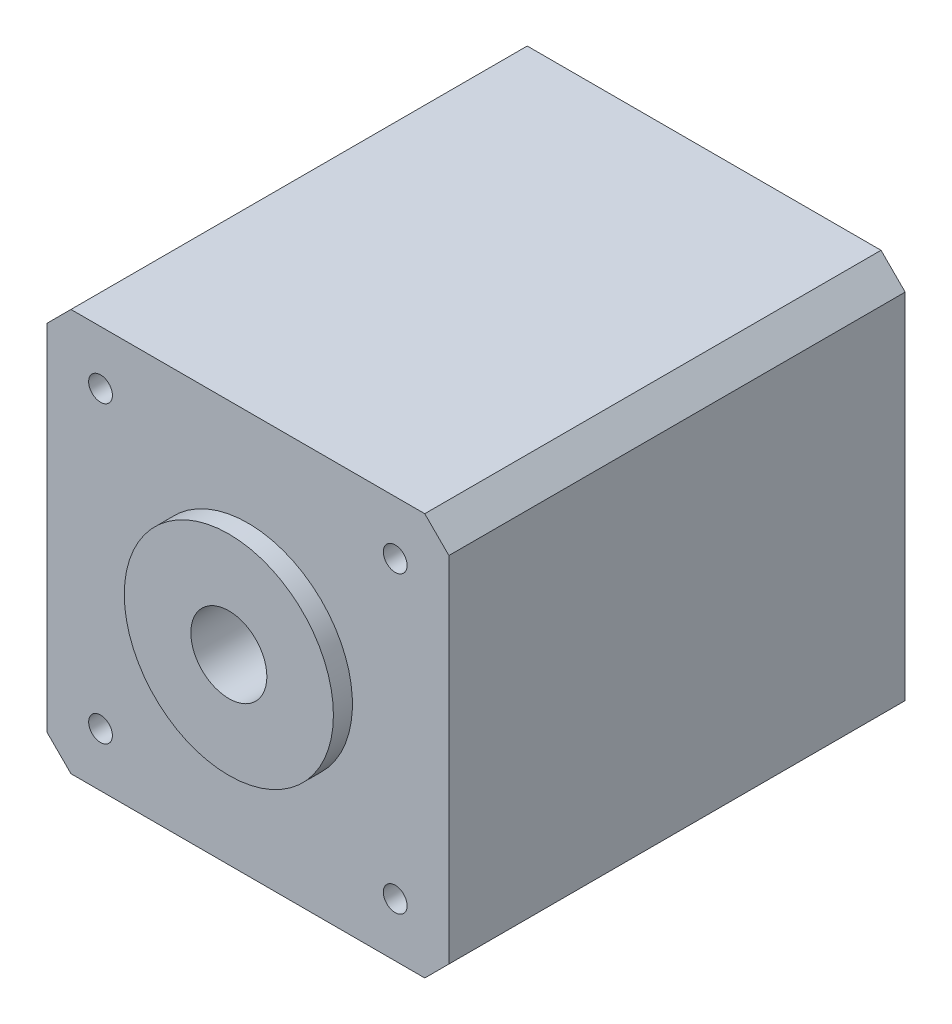
ISO-10303-21;
HEADER;
FILE_DESCRIPTION(('STEP AP214'),'2;1');
FILE_NAME('part.step','',(''),(''),'','','');
FILE_SCHEMA(('AUTOMOTIVE_DESIGN { 1 0 10303 214 1 1 1 1 }'));
ENDSEC;
DATA;
#1=APPLICATION_CONTEXT('core data for automotive mechanical design processes');
#2=APPLICATION_PROTOCOL_DEFINITION('international standard','automotive_design',2000,#1);
#3=PRODUCT_CONTEXT('',#1,'mechanical');
#4=PRODUCT('Part','Part','',(#3));
#5=PRODUCT_RELATED_PRODUCT_CATEGORY('part','',(#4));
#6=PRODUCT_DEFINITION_FORMATION('','',#4);
#7=PRODUCT_DEFINITION_CONTEXT('part definition',#1,'design');
#8=PRODUCT_DEFINITION('design','',#6,#7);
#9=PRODUCT_DEFINITION_SHAPE('','',#8);
#10=(LENGTH_UNIT() NAMED_UNIT(*) SI_UNIT(.MILLI.,.METRE.));
#11=(NAMED_UNIT(*) PLANE_ANGLE_UNIT() SI_UNIT($,.RADIAN.));
#12=(NAMED_UNIT(*) SI_UNIT($,.STERADIAN.) SOLID_ANGLE_UNIT());
#13=UNCERTAINTY_MEASURE_WITH_UNIT(LENGTH_MEASURE(1.E-05),#10,'distance_accuracy_value','');
#14=(GEOMETRIC_REPRESENTATION_CONTEXT(3) GLOBAL_UNCERTAINTY_ASSIGNED_CONTEXT((#13)) GLOBAL_UNIT_ASSIGNED_CONTEXT((#10,
#11,#12)) REPRESENTATION_CONTEXT('',''));
#15=CARTESIAN_POINT('',(0.,0.,0.));
#16=DIRECTION('',(0.,0.,1.));
#17=DIRECTION('',(1.,0.,0.));
#18=AXIS2_PLACEMENT_3D('',#15,#16,#17);
#19=CARTESIAN_POINT('',(0.,0.,48.));
#20=DIRECTION('',(1.,0.,0.));
#21=DIRECTION('',(0.,0.,-1.));
#22=AXIS2_PLACEMENT_3D('',#19,#20,#21);
#23=PLANE('',#22);
#24=DIRECTION('',(0.,-1.,0.));
#25=VECTOR('',#24,1.);
#26=CARTESIAN_POINT('',(0.,0.,0.));
#27=LINE('',#26,#25);
#28=CARTESIAN_POINT('',(0.,39.76,0.));
#29=VERTEX_POINT('',#28);
#30=CARTESIAN_POINT('',(0.,2.54,0.));
#31=VERTEX_POINT('',#30);
#32=EDGE_CURVE('E145',#29,#31,#27,.T.);
#33=ORIENTED_EDGE('',*,*,#32,.T.);
#34=DIRECTION('',(0.,0.,1.));
#35=VECTOR('',#34,1.);
#36=CARTESIAN_POINT('',(0.,2.54,48.));
#37=LINE('',#36,#35);
#38=CARTESIAN_POINT('',(0.,2.54,48.));
#39=VERTEX_POINT('',#38);
#40=EDGE_CURVE('E197',#31,#39,#37,.T.);
#41=ORIENTED_EDGE('',*,*,#40,.T.);
#42=DIRECTION('',(0.,-1.,0.));
#43=VECTOR('',#42,1.);
#44=CARTESIAN_POINT('',(0.,0.,48.));
#45=LINE('',#44,#43);
#46=CARTESIAN_POINT('',(0.,39.76,48.));
#47=VERTEX_POINT('',#46);
#48=EDGE_CURVE('E146',#47,#39,#45,.T.);
#49=ORIENTED_EDGE('',*,*,#48,.F.);
#50=DIRECTION('',(0.,0.,-1.));
#51=VECTOR('',#50,1.);
#52=CARTESIAN_POINT('',(0.,39.76,48.));
#53=LINE('',#52,#51);
#54=EDGE_CURVE('E194',#47,#29,#53,.T.);
#55=ORIENTED_EDGE('',*,*,#54,.T.);
#56=EDGE_LOOP('',(#33,#41,#49,#55));
#57=FACE_BOUND('',#56,.T.);
#58=ADVANCED_FACE('F35',(#57),#23,.F.);
#59=CARTESIAN_POINT('',(0.,0.,48.));
#60=DIRECTION('',(0.,1.,0.));
#61=DIRECTION('',(0.,0.,1.));
#62=AXIS2_PLACEMENT_3D('',#59,#60,#61);
#63=PLANE('',#62);
#64=DIRECTION('',(1.,0.,0.));
#65=VECTOR('',#64,1.);
#66=CARTESIAN_POINT('',(0.,0.,0.));
#67=LINE('',#66,#65);
#68=CARTESIAN_POINT('',(2.53999999999999,0.,0.));
#69=VERTEX_POINT('',#68);
#70=CARTESIAN_POINT('',(39.76,0.,0.));
#71=VERTEX_POINT('',#70);
#72=EDGE_CURVE('E160',#69,#71,#67,.T.);
#73=ORIENTED_EDGE('',*,*,#72,.T.);
#74=DIRECTION('',(0.,0.,1.));
#75=VECTOR('',#74,1.);
#76=CARTESIAN_POINT('',(39.76,0.,48.));
#77=LINE('',#76,#75);
#78=CARTESIAN_POINT('',(39.76,0.,48.));
#79=VERTEX_POINT('',#78);
#80=EDGE_CURVE('E185',#71,#79,#77,.T.);
#81=ORIENTED_EDGE('',*,*,#80,.T.);
#82=DIRECTION('',(1.,0.,0.));
#83=VECTOR('',#82,1.);
#84=CARTESIAN_POINT('',(0.,0.,48.));
#85=LINE('',#84,#83);
#86=CARTESIAN_POINT('',(2.53999999999999,0.,48.));
#87=VERTEX_POINT('',#86);
#88=EDGE_CURVE('E149',#87,#79,#85,.T.);
#89=ORIENTED_EDGE('',*,*,#88,.F.);
#90=DIRECTION('',(0.,0.,-1.));
#91=VECTOR('',#90,1.);
#92=CARTESIAN_POINT('',(2.53999999999999,0.,48.));
#93=LINE('',#92,#91);
#94=EDGE_CURVE('E182',#87,#69,#93,.T.);
#95=ORIENTED_EDGE('',*,*,#94,.T.);
#96=EDGE_LOOP('',(#73,#81,#89,#95));
#97=FACE_BOUND('',#96,.T.);
#98=ADVANCED_FACE('F222',(#97),#63,.F.);
#99=CARTESIAN_POINT('',(42.3,0.,48.));
#100=DIRECTION('',(-1.,0.,0.));
#101=DIRECTION('',(0.,0.,1.));
#102=AXIS2_PLACEMENT_3D('',#99,#100,#101);
#103=PLANE('',#102);
#104=DIRECTION('',(0.,1.,0.));
#105=VECTOR('',#104,1.);
#106=CARTESIAN_POINT('',(42.3,0.,48.));
#107=LINE('',#106,#105);
#108=CARTESIAN_POINT('',(42.3,2.53999999999999,48.));
#109=VERTEX_POINT('',#108);
#110=CARTESIAN_POINT('',(42.3,39.76,48.));
#111=VERTEX_POINT('',#110);
#112=EDGE_CURVE('E153',#109,#111,#107,.T.);
#113=ORIENTED_EDGE('',*,*,#112,.F.);
#114=DIRECTION('',(0.,0.,-1.));
#115=VECTOR('',#114,1.);
#116=CARTESIAN_POINT('',(42.3,2.53999999999999,48.));
#117=LINE('',#116,#115);
#118=CARTESIAN_POINT('',(42.3,2.53999999999999,0.));
#119=VERTEX_POINT('',#118);
#120=EDGE_CURVE('E171',#109,#119,#117,.T.);
#121=ORIENTED_EDGE('',*,*,#120,.T.);
#122=DIRECTION('',(0.,1.,0.));
#123=VECTOR('',#122,1.);
#124=CARTESIAN_POINT('',(42.3,0.,0.));
#125=LINE('',#124,#123);
#126=CARTESIAN_POINT('',(42.3,39.76,0.));
#127=VERTEX_POINT('',#126);
#128=EDGE_CURVE('E163',#119,#127,#125,.T.);
#129=ORIENTED_EDGE('',*,*,#128,.T.);
#130=DIRECTION('',(0.,0.,1.));
#131=VECTOR('',#130,1.);
#132=CARTESIAN_POINT('',(42.3,39.76,48.));
#133=LINE('',#132,#131);
#134=EDGE_CURVE('E169',#127,#111,#133,.T.);
#135=ORIENTED_EDGE('',*,*,#134,.T.);
#136=EDGE_LOOP('',(#113,#121,#129,#135));
#137=FACE_BOUND('',#136,.T.);
#138=ADVANCED_FACE('F230',(#137),#103,.F.);
#139=CARTESIAN_POINT('',(0.,42.3,48.));
#140=DIRECTION('',(0.,-1.,0.));
#141=DIRECTION('',(0.,0.,-1.));
#142=AXIS2_PLACEMENT_3D('',#139,#140,#141);
#143=PLANE('',#142);
#144=DIRECTION('',(-1.,0.,0.));
#145=VECTOR('',#144,1.);
#146=CARTESIAN_POINT('',(0.,42.3,0.));
#147=LINE('',#146,#145);
#148=CARTESIAN_POINT('',(39.76,42.3,0.));
#149=VERTEX_POINT('',#148);
#150=CARTESIAN_POINT('',(2.54000000000001,42.3,0.));
#151=VERTEX_POINT('',#150);
#152=EDGE_CURVE('E150',#149,#151,#147,.T.);
#153=ORIENTED_EDGE('',*,*,#152,.T.);
#154=DIRECTION('',(0.,0.,1.));
#155=VECTOR('',#154,1.);
#156=CARTESIAN_POINT('',(2.54000000000001,42.3,48.));
#157=LINE('',#156,#155);
#158=CARTESIAN_POINT('',(2.54000000000001,42.3,48.));
#159=VERTEX_POINT('',#158);
#160=EDGE_CURVE('E11',#151,#159,#157,.T.);
#161=ORIENTED_EDGE('',*,*,#160,.T.);
#162=DIRECTION('',(-1.,0.,0.));
#163=VECTOR('',#162,1.);
#164=CARTESIAN_POINT('',(0.,42.3,48.));
#165=LINE('',#164,#163);
#166=CARTESIAN_POINT('',(39.76,42.3,48.));
#167=VERTEX_POINT('',#166);
#168=EDGE_CURVE('E155',#167,#159,#165,.T.);
#169=ORIENTED_EDGE('',*,*,#168,.F.);
#170=DIRECTION('',(0.,0.,-1.));
#171=VECTOR('',#170,1.);
#172=CARTESIAN_POINT('',(39.76,42.3,48.));
#173=LINE('',#172,#171);
#174=EDGE_CURVE('E43',#167,#149,#173,.T.);
#175=ORIENTED_EDGE('',*,*,#174,.T.);
#176=EDGE_LOOP('',(#153,#161,#169,#175));
#177=FACE_BOUND('',#176,.T.);
#178=ADVANCED_FACE('F201',(#177),#143,.F.);
#179=CARTESIAN_POINT('',(0.,0.,48.));
#180=DIRECTION('',(0.,0.,-1.));
#181=DIRECTION('',(-1.,0.,0.));
#182=AXIS2_PLACEMENT_3D('',#179,#180,#181);
#183=PLANE('',#182);
#184=CARTESIAN_POINT('',(21.15,21.15,48.));
#185=DIRECTION('',(0.,0.,-1.));
#186=DIRECTION('',(-1.,0.,0.));
#187=AXIS2_PLACEMENT_3D('',#184,#185,#186);
#188=CIRCLE('',#187,11.);
#189=CARTESIAN_POINT('',(10.15,21.15,48.));
#190=VERTEX_POINT('',#189);
#191=EDGE_CURVE('E157',#190,#190,#188,.F.);
#192=ORIENTED_EDGE('',*,*,#191,.F.);
#193=EDGE_LOOP('',(#192));
#194=FACE_BOUND('',#193,.T.);
#195=CARTESIAN_POINT('',(36.65,36.65,48.));
#196=DIRECTION('',(0.,0.,1.));
#197=DIRECTION('',(1.,0.,0.));
#198=AXIS2_PLACEMENT_3D('',#195,#196,#197);
#199=CIRCLE('',#198,1.24999999999999);
#200=CARTESIAN_POINT('',(37.9,36.65,48.));
#201=VERTEX_POINT('',#200);
#202=EDGE_CURVE('E121',#201,#201,#199,.T.);
#203=ORIENTED_EDGE('',*,*,#202,.F.);
#204=EDGE_LOOP('',(#203));
#205=FACE_BOUND('',#204,.T.);
#206=CARTESIAN_POINT('',(5.64999999999999,5.65,48.));
#207=DIRECTION('',(0.,0.,1.));
#208=DIRECTION('',(1.,0.,0.));
#209=AXIS2_PLACEMENT_3D('',#206,#207,#208);
#210=CIRCLE('',#209,1.24999999999999);
#211=CARTESIAN_POINT('',(6.89999999999998,5.65,48.));
#212=VERTEX_POINT('',#211);
#213=EDGE_CURVE('E120',#212,#212,#210,.T.);
#214=ORIENTED_EDGE('',*,*,#213,.F.);
#215=EDGE_LOOP('',(#214));
#216=FACE_BOUND('',#215,.T.);
#217=CARTESIAN_POINT('',(5.64999999999999,36.65,48.));
#218=DIRECTION('',(0.,0.,1.));
#219=DIRECTION('',(1.,0.,0.));
#220=AXIS2_PLACEMENT_3D('',#217,#218,#219);
#221=CIRCLE('',#220,1.24999999999999);
#222=CARTESIAN_POINT('',(6.89999999999998,36.65,48.));
#223=VERTEX_POINT('',#222);
#224=EDGE_CURVE('E133',#223,#223,#221,.T.);
#225=ORIENTED_EDGE('',*,*,#224,.F.);
#226=EDGE_LOOP('',(#225));
#227=FACE_BOUND('',#226,.T.);
#228=CARTESIAN_POINT('',(36.65,5.65,48.));
#229=DIRECTION('',(0.,0.,1.));
#230=DIRECTION('',(1.,0.,0.));
#231=AXIS2_PLACEMENT_3D('',#228,#229,#230);
#232=CIRCLE('',#231,1.24999999999999);
#233=CARTESIAN_POINT('',(37.9,5.65,48.));
#234=VERTEX_POINT('',#233);
#235=EDGE_CURVE('E139',#234,#234,#232,.T.);
#236=ORIENTED_EDGE('',*,*,#235,.F.);
#237=EDGE_LOOP('',(#236));
#238=FACE_BOUND('',#237,.T.);
#239=ORIENTED_EDGE('',*,*,#88,.T.);
#240=DIRECTION('',(-0.707106781186549,-0.707106781186546,0.));
#241=VECTOR('',#240,1.);
#242=CARTESIAN_POINT('',(42.3,2.53999999999999,48.));
#243=LINE('',#242,#241);
#244=EDGE_CURVE('E192',#79,#109,#243,.F.);
#245=ORIENTED_EDGE('',*,*,#244,.T.);
#246=ORIENTED_EDGE('',*,*,#112,.T.);
#247=DIRECTION('',(0.707106781186546,-0.70710678118655,0.));
#248=VECTOR('',#247,1.);
#249=CARTESIAN_POINT('',(39.76,42.3,48.));
#250=LINE('',#249,#248);
#251=EDGE_CURVE('E55',#111,#167,#250,.F.);
#252=ORIENTED_EDGE('',*,*,#251,.T.);
#253=ORIENTED_EDGE('',*,*,#168,.T.);
#254=DIRECTION('',(0.70710678118655,0.707106781186546,0.));
#255=VECTOR('',#254,1.);
#256=CARTESIAN_POINT('',(0.,39.76,48.));
#257=LINE('',#256,#255);
#258=EDGE_CURVE('E188',#159,#47,#257,.F.);
#259=ORIENTED_EDGE('',*,*,#258,.T.);
#260=ORIENTED_EDGE('',*,*,#48,.T.);
#261=DIRECTION('',(-0.707106781186546,0.707106781186549,0.));
#262=VECTOR('',#261,1.);
#263=CARTESIAN_POINT('',(2.53999999999999,0.,48.));
#264=LINE('',#263,#262);
#265=EDGE_CURVE('E190',#39,#87,#264,.F.);
#266=ORIENTED_EDGE('',*,*,#265,.T.);
#267=EDGE_LOOP('',(#239,#245,#246,#252,#253,#259,#260,#266));
#268=FACE_BOUND('',#267,.T.);
#269=ADVANCED_FACE('F215',(#194,#205,#216,#227,#238,#268),#183,.F.);
#270=CARTESIAN_POINT('',(0.,0.,0.));
#271=DIRECTION('',(0.,0.,-1.));
#272=DIRECTION('',(-1.,0.,0.));
#273=AXIS2_PLACEMENT_3D('',#270,#271,#272);
#274=PLANE('',#273);
#275=CARTESIAN_POINT('',(21.15,21.15,0.));
#276=DIRECTION('',(0.,0.,1.));
#277=DIRECTION('',(1.,0.,0.));
#278=AXIS2_PLACEMENT_3D('',#275,#276,#277);
#279=CIRCLE('',#278,4.);
#280=CARTESIAN_POINT('',(25.15,21.15,0.));
#281=VERTEX_POINT('',#280);
#282=EDGE_CURVE('E473',#281,#281,#279,.T.);
#283=ORIENTED_EDGE('',*,*,#282,.T.);
#284=EDGE_LOOP('',(#283));
#285=FACE_BOUND('',#284,.T.);
#286=ORIENTED_EDGE('',*,*,#128,.F.);
#287=DIRECTION('',(0.707106781186549,0.707106781186546,0.));
#288=VECTOR('',#287,1.);
#289=CARTESIAN_POINT('',(19.8799999999999,-19.88,0.));
#290=LINE('',#289,#288);
#291=EDGE_CURVE('E180',#119,#71,#290,.F.);
#292=ORIENTED_EDGE('',*,*,#291,.T.);
#293=ORIENTED_EDGE('',*,*,#72,.F.);
#294=DIRECTION('',(0.707106781186546,-0.707106781186549,0.));
#295=VECTOR('',#294,1.);
#296=CARTESIAN_POINT('',(1.27,1.26999999999999,0.));
#297=LINE('',#296,#295);
#298=EDGE_CURVE('E178',#69,#31,#297,.F.);
#299=ORIENTED_EDGE('',*,*,#298,.T.);
#300=ORIENTED_EDGE('',*,*,#32,.F.);
#301=DIRECTION('',(-0.70710678118655,-0.707106781186546,0.));
#302=VECTOR('',#301,1.);
#303=CARTESIAN_POINT('',(-19.88,19.8800000000001,0.));
#304=LINE('',#303,#302);
#305=EDGE_CURVE('E176',#29,#151,#304,.F.);
#306=ORIENTED_EDGE('',*,*,#305,.T.);
#307=ORIENTED_EDGE('',*,*,#152,.F.);
#308=DIRECTION('',(-0.707106781186546,0.70710678118655,0.));
#309=VECTOR('',#308,1.);
#310=CARTESIAN_POINT('',(41.0300000000001,41.0299999999999,0.));
#311=LINE('',#310,#309);
#312=EDGE_CURVE('E174',#149,#127,#311,.F.);
#313=ORIENTED_EDGE('',*,*,#312,.T.);
#314=EDGE_LOOP('',(#286,#292,#293,#299,#300,#306,#307,#313));
#315=FACE_BOUND('',#314,.T.);
#316=ADVANCED_FACE('F205',(#285,#315),#274,.T.);
#317=CARTESIAN_POINT('',(36.65,5.65,40.132));
#318=DIRECTION('',(0.,0.,1.));
#319=DIRECTION('',(1.,0.,0.));
#320=AXIS2_PLACEMENT_3D('',#317,#318,#319);
#321=CONICAL_SURFACE('',#320,1.25,1.02974425867666);
#322=CARTESIAN_POINT('',(36.65,5.65,39.3809242262155));
#323=VERTEX_POINT('',#322);
#324=VERTEX_LOOP('',#323);
#325=FACE_BOUND('',#324,.T.);
#326=CARTESIAN_POINT('',(36.65,5.65,40.132));
#327=DIRECTION('',(0.,0.,1.));
#328=DIRECTION('',(1.,0.,0.));
#329=AXIS2_PLACEMENT_3D('',#326,#327,#328);
#330=CIRCLE('',#329,1.25);
#331=CARTESIAN_POINT('',(37.9,5.65,40.132));
#332=VERTEX_POINT('',#331);
#333=EDGE_CURVE('E142',#332,#332,#330,.T.);
#334=ORIENTED_EDGE('',*,*,#333,.T.);
#335=EDGE_LOOP('',(#334));
#336=FACE_BOUND('',#335,.T.);
#337=ADVANCED_FACE('F368',(#325,#336),#321,.F.);
#338=CARTESIAN_POINT('',(36.65,5.65,48.));
#339=DIRECTION('',(0.,0.,1.));
#340=DIRECTION('',(1.,0.,0.));
#341=AXIS2_PLACEMENT_3D('',#338,#339,#340);
#342=CYLINDRICAL_SURFACE('',#341,1.24999999999999);
#343=ORIENTED_EDGE('',*,*,#333,.F.);
#344=EDGE_LOOP('',(#343));
#345=FACE_BOUND('',#344,.T.);
#346=ORIENTED_EDGE('',*,*,#235,.T.);
#347=EDGE_LOOP('',(#346));
#348=FACE_BOUND('',#347,.T.);
#349=ADVANCED_FACE('F358',(#345,#348),#342,.F.);
#350=CARTESIAN_POINT('',(5.64999999999999,36.65,40.132));
#351=DIRECTION('',(0.,0.,1.));
#352=DIRECTION('',(1.,0.,0.));
#353=AXIS2_PLACEMENT_3D('',#350,#351,#352);
#354=CONICAL_SURFACE('',#353,1.25,1.02974425867665);
#355=CARTESIAN_POINT('',(5.64999999999999,36.65,39.3809242262155));
#356=VERTEX_POINT('',#355);
#357=VERTEX_LOOP('',#356);
#358=FACE_BOUND('',#357,.T.);
#359=CARTESIAN_POINT('',(5.64999999999999,36.65,40.132));
#360=DIRECTION('',(0.,0.,1.));
#361=DIRECTION('',(1.,0.,0.));
#362=AXIS2_PLACEMENT_3D('',#359,#360,#361);
#363=CIRCLE('',#362,1.25);
#364=CARTESIAN_POINT('',(6.89999999999999,36.65,40.132));
#365=VERTEX_POINT('',#364);
#366=EDGE_CURVE('E136',#365,#365,#363,.T.);
#367=ORIENTED_EDGE('',*,*,#366,.T.);
#368=EDGE_LOOP('',(#367));
#369=FACE_BOUND('',#368,.T.);
#370=ADVANCED_FACE('F348',(#358,#369),#354,.F.);
#371=CARTESIAN_POINT('',(5.64999999999999,36.65,48.));
#372=DIRECTION('',(0.,0.,1.));
#373=DIRECTION('',(1.,0.,0.));
#374=AXIS2_PLACEMENT_3D('',#371,#372,#373);
#375=CYLINDRICAL_SURFACE('',#374,1.24999999999999);
#376=ORIENTED_EDGE('',*,*,#366,.F.);
#377=EDGE_LOOP('',(#376));
#378=FACE_BOUND('',#377,.T.);
#379=ORIENTED_EDGE('',*,*,#224,.T.);
#380=EDGE_LOOP('',(#379));
#381=FACE_BOUND('',#380,.T.);
#382=ADVANCED_FACE('F338',(#378,#381),#375,.F.);
#383=CARTESIAN_POINT('',(5.64999999999999,5.65,40.132));
#384=DIRECTION('',(0.,0.,1.));
#385=DIRECTION('',(1.,0.,0.));
#386=AXIS2_PLACEMENT_3D('',#383,#384,#385);
#387=CONICAL_SURFACE('',#386,1.25,1.02974425867665);
#388=CARTESIAN_POINT('',(5.64999999999999,5.65,39.3809242262155));
#389=VERTEX_POINT('',#388);
#390=VERTEX_LOOP('',#389);
#391=FACE_BOUND('',#390,.T.);
#392=CARTESIAN_POINT('',(5.64999999999999,5.65,40.132));
#393=DIRECTION('',(0.,0.,1.));
#394=DIRECTION('',(1.,0.,0.));
#395=AXIS2_PLACEMENT_3D('',#392,#393,#394);
#396=CIRCLE('',#395,1.25);
#397=CARTESIAN_POINT('',(6.89999999999999,5.65,40.132));
#398=VERTEX_POINT('',#397);
#399=EDGE_CURVE('E124',#398,#398,#396,.T.);
#400=ORIENTED_EDGE('',*,*,#399,.T.);
#401=EDGE_LOOP('',(#400));
#402=FACE_BOUND('',#401,.T.);
#403=ADVANCED_FACE('F328',(#391,#402),#387,.F.);
#404=CARTESIAN_POINT('',(5.64999999999999,5.65,48.));
#405=DIRECTION('',(0.,0.,1.));
#406=DIRECTION('',(1.,0.,0.));
#407=AXIS2_PLACEMENT_3D('',#404,#405,#406);
#408=CYLINDRICAL_SURFACE('',#407,1.24999999999999);
#409=ORIENTED_EDGE('',*,*,#399,.F.);
#410=EDGE_LOOP('',(#409));
#411=FACE_BOUND('',#410,.T.);
#412=ORIENTED_EDGE('',*,*,#213,.T.);
#413=EDGE_LOOP('',(#412));
#414=FACE_BOUND('',#413,.T.);
#415=ADVANCED_FACE('F114',(#411,#414),#408,.F.);
#416=CARTESIAN_POINT('',(36.65,36.65,40.132));
#417=DIRECTION('',(0.,0.,1.));
#418=DIRECTION('',(1.,0.,0.));
#419=AXIS2_PLACEMENT_3D('',#416,#417,#418);
#420=CONICAL_SURFACE('',#419,1.25,1.02974425867666);
#421=CARTESIAN_POINT('',(36.65,36.65,39.3809242262155));
#422=VERTEX_POINT('',#421);
#423=VERTEX_LOOP('',#422);
#424=FACE_BOUND('',#423,.T.);
#425=CARTESIAN_POINT('',(36.65,36.65,40.132));
#426=DIRECTION('',(0.,0.,1.));
#427=DIRECTION('',(1.,0.,0.));
#428=AXIS2_PLACEMENT_3D('',#425,#426,#427);
#429=CIRCLE('',#428,1.25);
#430=CARTESIAN_POINT('',(37.9,36.65,40.132));
#431=VERTEX_POINT('',#430);
#432=EDGE_CURVE('E118',#431,#431,#429,.T.);
#433=ORIENTED_EDGE('',*,*,#432,.T.);
#434=EDGE_LOOP('',(#433));
#435=FACE_BOUND('',#434,.T.);
#436=ADVANCED_FACE('F110',(#424,#435),#420,.F.);
#437=CARTESIAN_POINT('',(36.65,36.65,48.));
#438=DIRECTION('',(0.,0.,1.));
#439=DIRECTION('',(1.,0.,0.));
#440=AXIS2_PLACEMENT_3D('',#437,#438,#439);
#441=CYLINDRICAL_SURFACE('',#440,1.24999999999999);
#442=ORIENTED_EDGE('',*,*,#432,.F.);
#443=EDGE_LOOP('',(#442));
#444=FACE_BOUND('',#443,.T.);
#445=ORIENTED_EDGE('',*,*,#202,.T.);
#446=EDGE_LOOP('',(#445));
#447=FACE_BOUND('',#446,.T.);
#448=ADVANCED_FACE('F113',(#444,#447),#441,.F.);
#449=CARTESIAN_POINT('',(21.15,21.15,50.));
#450=DIRECTION('',(0.,0.,-1.));
#451=DIRECTION('',(-1.,0.,0.));
#452=AXIS2_PLACEMENT_3D('',#449,#450,#451);
#453=CYLINDRICAL_SURFACE('',#452,11.);
#454=CARTESIAN_POINT('',(21.15,21.15,50.));
#455=DIRECTION('',(0.,0.,1.));
#456=DIRECTION('',(1.,0.,0.));
#457=AXIS2_PLACEMENT_3D('',#454,#455,#456);
#458=CIRCLE('',#457,11.);
#459=CARTESIAN_POINT('',(32.15,21.15,50.));
#460=VERTEX_POINT('',#459);
#461=EDGE_CURVE('E127',#460,#460,#458,.T.);
#462=ORIENTED_EDGE('',*,*,#461,.F.);
#463=EDGE_LOOP('',(#462));
#464=FACE_BOUND('',#463,.T.);
#465=ORIENTED_EDGE('',*,*,#191,.T.);
#466=EDGE_LOOP('',(#465));
#467=FACE_BOUND('',#466,.T.);
#468=ADVANCED_FACE('F295',(#464,#467),#453,.T.);
#469=CARTESIAN_POINT('',(21.15,21.15,50.));
#470=DIRECTION('',(0.,0.,1.));
#471=DIRECTION('',(1.,0.,0.));
#472=AXIS2_PLACEMENT_3D('',#469,#470,#471);
#473=PLANE('',#472);
#474=CARTESIAN_POINT('',(21.15,21.15,50.));
#475=DIRECTION('',(0.,0.,1.));
#476=DIRECTION('',(1.,0.,0.));
#477=AXIS2_PLACEMENT_3D('',#474,#475,#476);
#478=CIRCLE('',#477,4.);
#479=CARTESIAN_POINT('',(25.15,21.15,50.));
#480=VERTEX_POINT('',#479);
#481=EDGE_CURVE('E474',#480,#480,#478,.T.);
#482=ORIENTED_EDGE('',*,*,#481,.F.);
#483=EDGE_LOOP('',(#482));
#484=FACE_BOUND('',#483,.T.);
#485=ORIENTED_EDGE('',*,*,#461,.T.);
#486=EDGE_LOOP('',(#485));
#487=FACE_BOUND('',#486,.T.);
#488=ADVANCED_FACE('F284',(#484,#487),#473,.T.);
#489=CARTESIAN_POINT('',(21.15,21.15,0.));
#490=DIRECTION('',(0.,0.,1.));
#491=DIRECTION('',(1.,0.,0.));
#492=AXIS2_PLACEMENT_3D('',#489,#490,#491);
#493=CYLINDRICAL_SURFACE('',#492,4.);
#494=ORIENTED_EDGE('',*,*,#282,.F.);
#495=EDGE_LOOP('',(#494));
#496=FACE_BOUND('',#495,.T.);
#497=ORIENTED_EDGE('',*,*,#481,.T.);
#498=EDGE_LOOP('',(#497));
#499=FACE_BOUND('',#498,.T.);
#500=ADVANCED_FACE('F246',(#496,#499),#493,.F.);
#501=CARTESIAN_POINT('',(42.3,2.53999999999999,48.));
#502=DIRECTION('',(-0.707106781186546,0.707106781186549,0.));
#503=DIRECTION('',(0.,0.,-1.));
#504=AXIS2_PLACEMENT_3D('',#501,#502,#503);
#505=PLANE('',#504);
#506=ORIENTED_EDGE('',*,*,#244,.F.);
#507=ORIENTED_EDGE('',*,*,#80,.F.);
#508=ORIENTED_EDGE('',*,*,#291,.F.);
#509=ORIENTED_EDGE('',*,*,#120,.F.);
#510=EDGE_LOOP('',(#506,#507,#508,#509));
#511=FACE_BOUND('',#510,.T.);
#512=ADVANCED_FACE('F227',(#511),#505,.F.);
#513=CARTESIAN_POINT('',(2.53999999999999,0.,48.));
#514=DIRECTION('',(0.707106781186549,0.707106781186546,0.));
#515=DIRECTION('',(0.,0.,-1.));
#516=AXIS2_PLACEMENT_3D('',#513,#514,#515);
#517=PLANE('',#516);
#518=ORIENTED_EDGE('',*,*,#265,.F.);
#519=ORIENTED_EDGE('',*,*,#40,.F.);
#520=ORIENTED_EDGE('',*,*,#298,.F.);
#521=ORIENTED_EDGE('',*,*,#94,.F.);
#522=EDGE_LOOP('',(#518,#519,#520,#521));
#523=FACE_BOUND('',#522,.T.);
#524=ADVANCED_FACE('F219',(#523),#517,.F.);
#525=CARTESIAN_POINT('',(0.,39.76,48.));
#526=DIRECTION('',(0.707106781186546,-0.70710678118655,0.));
#527=DIRECTION('',(0.,0.,-1.));
#528=AXIS2_PLACEMENT_3D('',#525,#526,#527);
#529=PLANE('',#528);
#530=ORIENTED_EDGE('',*,*,#258,.F.);
#531=ORIENTED_EDGE('',*,*,#160,.F.);
#532=ORIENTED_EDGE('',*,*,#305,.F.);
#533=ORIENTED_EDGE('',*,*,#54,.F.);
#534=EDGE_LOOP('',(#530,#531,#532,#533));
#535=FACE_BOUND('',#534,.T.);
#536=ADVANCED_FACE('F210',(#535),#529,.F.);
#537=CARTESIAN_POINT('',(39.76,42.3,48.));
#538=DIRECTION('',(-0.70710678118655,-0.707106781186546,0.));
#539=DIRECTION('',(0.,0.,-1.));
#540=AXIS2_PLACEMENT_3D('',#537,#538,#539);
#541=PLANE('',#540);
#542=ORIENTED_EDGE('',*,*,#251,.F.);
#543=ORIENTED_EDGE('',*,*,#134,.F.);
#544=ORIENTED_EDGE('',*,*,#312,.F.);
#545=ORIENTED_EDGE('',*,*,#174,.F.);
#546=EDGE_LOOP('',(#542,#543,#544,#545));
#547=FACE_BOUND('',#546,.T.);
#548=ADVANCED_FACE('F37',(#547),#541,.F.);
#549=CLOSED_SHELL('',(#58,#98,#138,#178,#269,#316,#337,#349,#370,#382,#403,#415,#436,#448,#468,
#488,#500,#512,#524,#536,#548));
#550=MANIFOLD_SOLID_BREP('B2',#549);
#551=ADVANCED_BREP_SHAPE_REPRESENTATION('',(#18,#550),#14);
#552=SHAPE_DEFINITION_REPRESENTATION(#9,#551);
ENDSEC;
END-ISO-10303-21;
